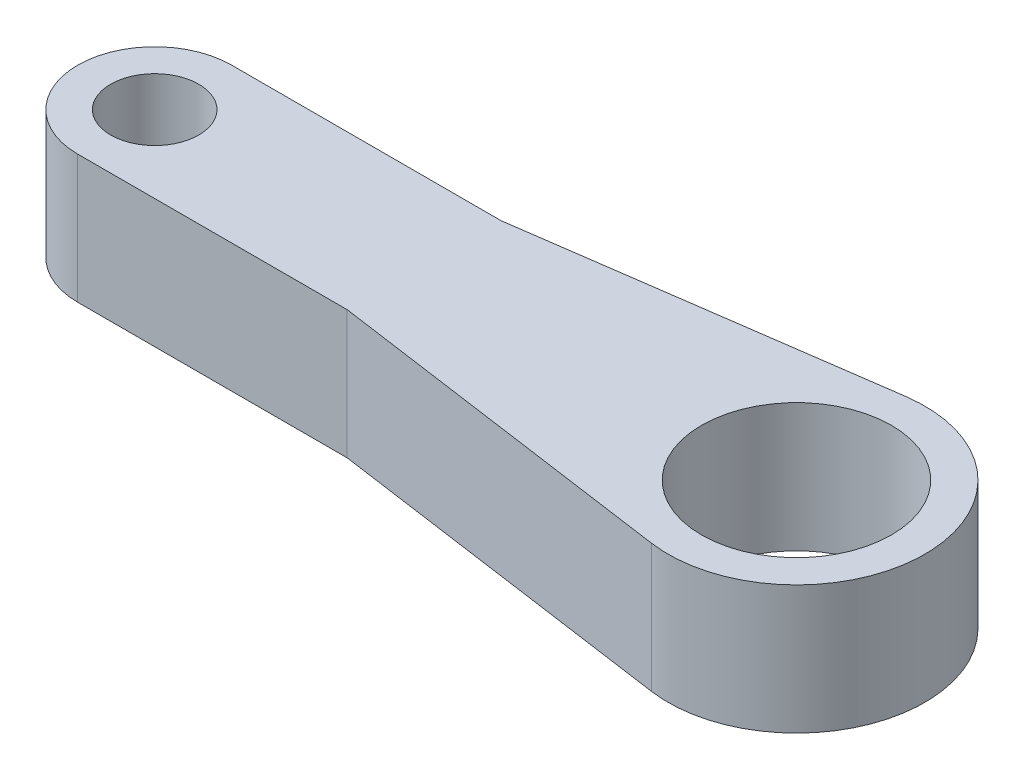
ISO-10303-21;
HEADER;
FILE_DESCRIPTION(('STEP AP214'),'2;1');
FILE_NAME('part.step','',(''),(''),'','','');
FILE_SCHEMA(('AUTOMOTIVE_DESIGN { 1 0 10303 214 1 1 1 1 }'));
ENDSEC;
DATA;
#1=APPLICATION_CONTEXT('core data for automotive mechanical design processes');
#2=APPLICATION_PROTOCOL_DEFINITION('international standard','automotive_design',2000,#1);
#3=PRODUCT_CONTEXT('',#1,'mechanical');
#4=PRODUCT('Part','Part','',(#3));
#5=PRODUCT_RELATED_PRODUCT_CATEGORY('part','',(#4));
#6=PRODUCT_DEFINITION_FORMATION('','',#4);
#7=PRODUCT_DEFINITION_CONTEXT('part definition',#1,'design');
#8=PRODUCT_DEFINITION('design','',#6,#7);
#9=PRODUCT_DEFINITION_SHAPE('','',#8);
#10=(LENGTH_UNIT() NAMED_UNIT(*) SI_UNIT(.MILLI.,.METRE.));
#11=(NAMED_UNIT(*) PLANE_ANGLE_UNIT() SI_UNIT($,.RADIAN.));
#12=(NAMED_UNIT(*) SI_UNIT($,.STERADIAN.) SOLID_ANGLE_UNIT());
#13=UNCERTAINTY_MEASURE_WITH_UNIT(LENGTH_MEASURE(1.E-05),#10,'distance_accuracy_value','');
#14=(GEOMETRIC_REPRESENTATION_CONTEXT(3) GLOBAL_UNCERTAINTY_ASSIGNED_CONTEXT((#13)) GLOBAL_UNIT_ASSIGNED_CONTEXT((#10,
#11,#12)) REPRESENTATION_CONTEXT('',''));
#15=CARTESIAN_POINT('',(0.,0.,0.));
#16=DIRECTION('',(0.,0.,1.));
#17=DIRECTION('',(1.,0.,0.));
#18=AXIS2_PLACEMENT_3D('',#15,#16,#17);
#19=CARTESIAN_POINT('',(0.,7.5,0.));
#20=DIRECTION('',(0.,-1.,0.));
#21=DIRECTION('',(0.,0.,-1.));
#22=AXIS2_PLACEMENT_3D('',#19,#20,#21);
#23=CYLINDRICAL_SURFACE('',#22,15.);
#24=CARTESIAN_POINT('',(0.,-7.5,0.));
#25=DIRECTION('',(0.,1.,0.));
#26=DIRECTION('',(0.,0.,1.));
#27=AXIS2_PLACEMENT_3D('',#24,#25,#26);
#28=CIRCLE('',#27,15.);
#29=CARTESIAN_POINT('',(-2.09951564919277,-7.5,14.8523410289016));
#30=VERTEX_POINT('',#29);
#31=CARTESIAN_POINT('',(-2.09951564919277,-7.5,-14.8523410289016));
#32=VERTEX_POINT('',#31);
#33=EDGE_CURVE('E137',#30,#32,#28,.T.);
#34=ORIENTED_EDGE('',*,*,#33,.T.);
#35=DIRECTION('',(0.,-1.,0.));
#36=VECTOR('',#35,1.);
#37=CARTESIAN_POINT('',(-2.09951564919277,7.5,-14.8523410289016));
#38=LINE('',#37,#36);
#39=CARTESIAN_POINT('',(-2.09951564919277,7.5,-14.8523410289016));
#40=VERTEX_POINT('',#39);
#41=EDGE_CURVE('E11',#40,#32,#38,.T.);
#42=ORIENTED_EDGE('',*,*,#41,.F.);
#43=CARTESIAN_POINT('',(0.,7.5,0.));
#44=DIRECTION('',(0.,1.,0.));
#45=DIRECTION('',(0.,0.,1.));
#46=AXIS2_PLACEMENT_3D('',#43,#44,#45);
#47=CIRCLE('',#46,15.);
#48=CARTESIAN_POINT('',(-2.09951564919277,7.5,14.8523410289016));
#49=VERTEX_POINT('',#48);
#50=EDGE_CURVE('E92',#49,#40,#47,.T.);
#51=ORIENTED_EDGE('',*,*,#50,.F.);
#52=DIRECTION('',(0.,-1.,0.));
#53=VECTOR('',#52,1.);
#54=CARTESIAN_POINT('',(-2.09951564919277,7.5,14.8523410289016));
#55=LINE('',#54,#53);
#56=EDGE_CURVE('E136',#49,#30,#55,.T.);
#57=ORIENTED_EDGE('',*,*,#56,.T.);
#58=EDGE_LOOP('',(#34,#42,#51,#57));
#59=FACE_BOUND('',#58,.T.);
#60=ADVANCED_FACE('F41',(#59),#23,.T.);
#61=CARTESIAN_POINT('',(-2.09951564919277,7.5,-14.8523410289016));
#62=DIRECTION('',(-0.139967709946185,0.,-0.990156068593442));
#63=DIRECTION('',(-0.990156068593442,0.,0.139967709946185));
#64=AXIS2_PLACEMENT_3D('',#61,#62,#63);
#65=PLANE('',#64);
#66=DIRECTION('',(0.990156068593442,0.,-0.139967709946185));
#67=VECTOR('',#66,1.);
#68=CARTESIAN_POINT('',(-2.09951564919277,-7.5,-14.8523410289016));
#69=LINE('',#68,#67);
#70=CARTESIAN_POINT('',(-43.5,-7.5,-8.99999999999999));
#71=VERTEX_POINT('',#70);
#72=EDGE_CURVE('E141',#71,#32,#69,.T.);
#73=ORIENTED_EDGE('',*,*,#72,.F.);
#74=DIRECTION('',(0.,-1.,0.));
#75=VECTOR('',#74,1.);
#76=CARTESIAN_POINT('',(-43.5,7.5,-8.99999999999999));
#77=LINE('',#76,#75);
#78=CARTESIAN_POINT('',(-43.5,7.5,-8.99999999999999));
#79=VERTEX_POINT('',#78);
#80=EDGE_CURVE('E50',#79,#71,#77,.T.);
#81=ORIENTED_EDGE('',*,*,#80,.F.);
#82=DIRECTION('',(0.990156068593442,0.,-0.139967709946185));
#83=VECTOR('',#82,1.);
#84=CARTESIAN_POINT('',(-2.09951564919277,7.5,-14.8523410289016));
#85=LINE('',#84,#83);
#86=EDGE_CURVE('E291',#79,#40,#85,.T.);
#87=ORIENTED_EDGE('',*,*,#86,.T.);
#88=ORIENTED_EDGE('',*,*,#41,.T.);
#89=EDGE_LOOP('',(#73,#81,#87,#88));
#90=FACE_BOUND('',#89,.T.);
#91=ADVANCED_FACE('F175',(#90),#65,.T.);
#92=CARTESIAN_POINT('',(0.,7.5,-8.99999999999999));
#93=DIRECTION('',(0.,0.,-1.));
#94=DIRECTION('',(-1.,0.,0.));
#95=AXIS2_PLACEMENT_3D('',#92,#93,#94);
#96=PLANE('',#95);
#97=DIRECTION('',(1.,0.,0.));
#98=VECTOR('',#97,1.);
#99=CARTESIAN_POINT('',(0.,-7.5,-8.99999999999999));
#100=LINE('',#99,#98);
#101=CARTESIAN_POINT('',(-75.,-7.5,-8.99999999999999));
#102=VERTEX_POINT('',#101);
#103=EDGE_CURVE('E145',#102,#71,#100,.T.);
#104=ORIENTED_EDGE('',*,*,#103,.F.);
#105=DIRECTION('',(0.,-1.,0.));
#106=VECTOR('',#105,1.);
#107=CARTESIAN_POINT('',(-75.,7.5,-8.99999999999999));
#108=LINE('',#107,#106);
#109=CARTESIAN_POINT('',(-75.,7.5,-8.99999999999999));
#110=VERTEX_POINT('',#109);
#111=EDGE_CURVE('E118',#110,#102,#108,.T.);
#112=ORIENTED_EDGE('',*,*,#111,.F.);
#113=DIRECTION('',(1.,0.,0.));
#114=VECTOR('',#113,1.);
#115=CARTESIAN_POINT('',(0.,7.5,-8.99999999999999));
#116=LINE('',#115,#114);
#117=EDGE_CURVE('E109',#110,#79,#116,.T.);
#118=ORIENTED_EDGE('',*,*,#117,.T.);
#119=ORIENTED_EDGE('',*,*,#80,.T.);
#120=EDGE_LOOP('',(#104,#112,#118,#119));
#121=FACE_BOUND('',#120,.T.);
#122=ADVANCED_FACE('F172',(#121),#96,.T.);
#123=CARTESIAN_POINT('',(-75.,7.5,0.));
#124=DIRECTION('',(0.,-1.,0.));
#125=DIRECTION('',(0.,0.,-1.));
#126=AXIS2_PLACEMENT_3D('',#123,#124,#125);
#127=CYLINDRICAL_SURFACE('',#126,9.);
#128=CARTESIAN_POINT('',(-75.,-7.5,0.));
#129=DIRECTION('',(0.,1.,0.));
#130=DIRECTION('',(0.,0.,1.));
#131=AXIS2_PLACEMENT_3D('',#128,#129,#130);
#132=CIRCLE('',#131,9.);
#133=CARTESIAN_POINT('',(-75.,-7.5,9.));
#134=VERTEX_POINT('',#133);
#135=EDGE_CURVE('E116',#102,#134,#132,.T.);
#136=ORIENTED_EDGE('',*,*,#135,.T.);
#137=DIRECTION('',(0.,-1.,0.));
#138=VECTOR('',#137,1.);
#139=CARTESIAN_POINT('',(-75.,7.5,9.));
#140=LINE('',#139,#138);
#141=CARTESIAN_POINT('',(-75.,7.5,9.));
#142=VERTEX_POINT('',#141);
#143=EDGE_CURVE('E113',#142,#134,#140,.T.);
#144=ORIENTED_EDGE('',*,*,#143,.F.);
#145=CARTESIAN_POINT('',(-75.,7.5,0.));
#146=DIRECTION('',(0.,1.,0.));
#147=DIRECTION('',(0.,0.,1.));
#148=AXIS2_PLACEMENT_3D('',#145,#146,#147);
#149=CIRCLE('',#148,9.);
#150=EDGE_CURVE('E102',#110,#142,#149,.T.);
#151=ORIENTED_EDGE('',*,*,#150,.F.);
#152=ORIENTED_EDGE('',*,*,#111,.T.);
#153=EDGE_LOOP('',(#136,#144,#151,#152));
#154=FACE_BOUND('',#153,.T.);
#155=ADVANCED_FACE('F114',(#154),#127,.T.);
#156=CARTESIAN_POINT('',(0.,7.5,9.));
#157=DIRECTION('',(0.,0.,-1.));
#158=DIRECTION('',(-1.,0.,0.));
#159=AXIS2_PLACEMENT_3D('',#156,#157,#158);
#160=PLANE('',#159);
#161=DIRECTION('',(1.,0.,0.));
#162=VECTOR('',#161,1.);
#163=CARTESIAN_POINT('',(0.,-7.5,9.));
#164=LINE('',#163,#162);
#165=CARTESIAN_POINT('',(-43.5,-7.5,9.));
#166=VERTEX_POINT('',#165);
#167=EDGE_CURVE('E80',#134,#166,#164,.T.);
#168=ORIENTED_EDGE('',*,*,#167,.T.);
#169=DIRECTION('',(0.,-1.,0.));
#170=VECTOR('',#169,1.);
#171=CARTESIAN_POINT('',(-43.5,7.5,9.));
#172=LINE('',#171,#170);
#173=CARTESIAN_POINT('',(-43.5,7.5,9.));
#174=VERTEX_POINT('',#173);
#175=EDGE_CURVE('E119',#174,#166,#172,.T.);
#176=ORIENTED_EDGE('',*,*,#175,.F.);
#177=DIRECTION('',(1.,0.,0.));
#178=VECTOR('',#177,1.);
#179=CARTESIAN_POINT('',(0.,7.5,9.));
#180=LINE('',#179,#178);
#181=EDGE_CURVE('E107',#142,#174,#180,.T.);
#182=ORIENTED_EDGE('',*,*,#181,.F.);
#183=ORIENTED_EDGE('',*,*,#143,.T.);
#184=EDGE_LOOP('',(#168,#176,#182,#183));
#185=FACE_BOUND('',#184,.T.);
#186=ADVANCED_FACE('F121',(#185),#160,.F.);
#187=CARTESIAN_POINT('',(-75.,7.5,0.));
#188=DIRECTION('',(0.,-1.,0.));
#189=DIRECTION('',(0.,0.,-1.));
#190=AXIS2_PLACEMENT_3D('',#187,#188,#189);
#191=CYLINDRICAL_SURFACE('',#190,5.15);
#192=CARTESIAN_POINT('',(-75.,7.5,0.));
#193=DIRECTION('',(0.,1.,0.));
#194=DIRECTION('',(0.,0.,1.));
#195=AXIS2_PLACEMENT_3D('',#192,#193,#194);
#196=CIRCLE('',#195,5.15);
#197=CARTESIAN_POINT('',(-75.,7.5,5.15));
#198=VERTEX_POINT('',#197);
#199=EDGE_CURVE('E125',#198,#198,#196,.T.);
#200=ORIENTED_EDGE('',*,*,#199,.T.);
#201=EDGE_LOOP('',(#200));
#202=FACE_BOUND('',#201,.T.);
#203=CARTESIAN_POINT('',(-75.,-7.5,0.));
#204=DIRECTION('',(0.,1.,0.));
#205=DIRECTION('',(0.,0.,1.));
#206=AXIS2_PLACEMENT_3D('',#203,#204,#205);
#207=CIRCLE('',#206,5.15);
#208=CARTESIAN_POINT('',(-75.,-7.5,5.15));
#209=VERTEX_POINT('',#208);
#210=EDGE_CURVE('E155',#209,#209,#207,.T.);
#211=ORIENTED_EDGE('',*,*,#210,.F.);
#212=EDGE_LOOP('',(#211));
#213=FACE_BOUND('',#212,.T.);
#214=ADVANCED_FACE('F184',(#202,#213),#191,.F.);
#215=CARTESIAN_POINT('',(-2.09951564919277,7.5,14.8523410289016));
#216=DIRECTION('',(0.139967709946185,0.,-0.990156068593442));
#217=DIRECTION('',(-0.990156068593442,0.,-0.139967709946185));
#218=AXIS2_PLACEMENT_3D('',#215,#216,#217);
#219=PLANE('',#218);
#220=DIRECTION('',(0.990156068593442,0.,0.139967709946185));
#221=VECTOR('',#220,1.);
#222=CARTESIAN_POINT('',(-2.09951564919277,-7.5,14.8523410289016));
#223=LINE('',#222,#221);
#224=EDGE_CURVE('E86',#166,#30,#223,.T.);
#225=ORIENTED_EDGE('',*,*,#224,.T.);
#226=ORIENTED_EDGE('',*,*,#56,.F.);
#227=DIRECTION('',(0.990156068593442,0.,0.139967709946185));
#228=VECTOR('',#227,1.);
#229=CARTESIAN_POINT('',(-2.09951564919277,7.5,14.8523410289016));
#230=LINE('',#229,#228);
#231=EDGE_CURVE('E58',#174,#49,#230,.T.);
#232=ORIENTED_EDGE('',*,*,#231,.F.);
#233=ORIENTED_EDGE('',*,*,#175,.T.);
#234=EDGE_LOOP('',(#225,#226,#232,#233));
#235=FACE_BOUND('',#234,.T.);
#236=ADVANCED_FACE('F181',(#235),#219,.F.);
#237=CARTESIAN_POINT('',(0.,7.5,0.));
#238=DIRECTION('',(0.,-1.,0.));
#239=DIRECTION('',(0.,0.,-1.));
#240=AXIS2_PLACEMENT_3D('',#237,#238,#239);
#241=CYLINDRICAL_SURFACE('',#240,11.1);
#242=CARTESIAN_POINT('',(0.,7.5,0.));
#243=DIRECTION('',(0.,1.,0.));
#244=DIRECTION('',(0.,0.,1.));
#245=AXIS2_PLACEMENT_3D('',#242,#243,#244);
#246=CIRCLE('',#245,11.1);
#247=CARTESIAN_POINT('',(0.,7.5,11.1));
#248=VERTEX_POINT('',#247);
#249=EDGE_CURVE('E132',#248,#248,#246,.T.);
#250=ORIENTED_EDGE('',*,*,#249,.T.);
#251=EDGE_LOOP('',(#250));
#252=FACE_BOUND('',#251,.T.);
#253=CARTESIAN_POINT('',(0.,-7.5,0.));
#254=DIRECTION('',(0.,1.,0.));
#255=DIRECTION('',(0.,0.,1.));
#256=AXIS2_PLACEMENT_3D('',#253,#254,#255);
#257=CIRCLE('',#256,11.1);
#258=CARTESIAN_POINT('',(0.,-7.5,11.1));
#259=VERTEX_POINT('',#258);
#260=EDGE_CURVE('E159',#259,#259,#257,.T.);
#261=ORIENTED_EDGE('',*,*,#260,.F.);
#262=EDGE_LOOP('',(#261));
#263=FACE_BOUND('',#262,.T.);
#264=ADVANCED_FACE('F183',(#252,#263),#241,.F.);
#265=CARTESIAN_POINT('',(0.,7.5,0.));
#266=DIRECTION('',(0.,1.,0.));
#267=DIRECTION('',(0.,0.,1.));
#268=AXIS2_PLACEMENT_3D('',#265,#266,#267);
#269=PLANE('',#268);
#270=ORIENTED_EDGE('',*,*,#50,.T.);
#271=ORIENTED_EDGE('',*,*,#86,.F.);
#272=ORIENTED_EDGE('',*,*,#117,.F.);
#273=ORIENTED_EDGE('',*,*,#150,.T.);
#274=ORIENTED_EDGE('',*,*,#181,.T.);
#275=ORIENTED_EDGE('',*,*,#231,.T.);
#276=EDGE_LOOP('',(#270,#271,#272,#273,#274,#275));
#277=FACE_BOUND('',#276,.T.);
#278=ORIENTED_EDGE('',*,*,#199,.F.);
#279=EDGE_LOOP('',(#278));
#280=FACE_BOUND('',#279,.T.);
#281=ORIENTED_EDGE('',*,*,#249,.F.);
#282=EDGE_LOOP('',(#281));
#283=FACE_BOUND('',#282,.T.);
#284=ADVANCED_FACE('F104',(#277,#280,#283),#269,.T.);
#285=CARTESIAN_POINT('',(0.,-7.5,0.));
#286=DIRECTION('',(0.,1.,0.));
#287=DIRECTION('',(0.,0.,1.));
#288=AXIS2_PLACEMENT_3D('',#285,#286,#287);
#289=PLANE('',#288);
#290=ORIENTED_EDGE('',*,*,#33,.F.);
#291=ORIENTED_EDGE('',*,*,#224,.F.);
#292=ORIENTED_EDGE('',*,*,#167,.F.);
#293=ORIENTED_EDGE('',*,*,#135,.F.);
#294=ORIENTED_EDGE('',*,*,#103,.T.);
#295=ORIENTED_EDGE('',*,*,#72,.T.);
#296=EDGE_LOOP('',(#290,#291,#292,#293,#294,#295));
#297=FACE_BOUND('',#296,.T.);
#298=ORIENTED_EDGE('',*,*,#210,.T.);
#299=EDGE_LOOP('',(#298));
#300=FACE_BOUND('',#299,.T.);
#301=ORIENTED_EDGE('',*,*,#260,.T.);
#302=EDGE_LOOP('',(#301));
#303=FACE_BOUND('',#302,.T.);
#304=ADVANCED_FACE('F178',(#297,#300,#303),#289,.F.);
#305=CLOSED_SHELL('',(#60,#91,#122,#155,#186,#214,#236,#264,#284,#304));
#306=MANIFOLD_SOLID_BREP('B2',#305);
#307=ADVANCED_BREP_SHAPE_REPRESENTATION('',(#18,#306),#14);
#308=SHAPE_DEFINITION_REPRESENTATION(#9,#307);
ENDSEC;
END-ISO-10303-21;
